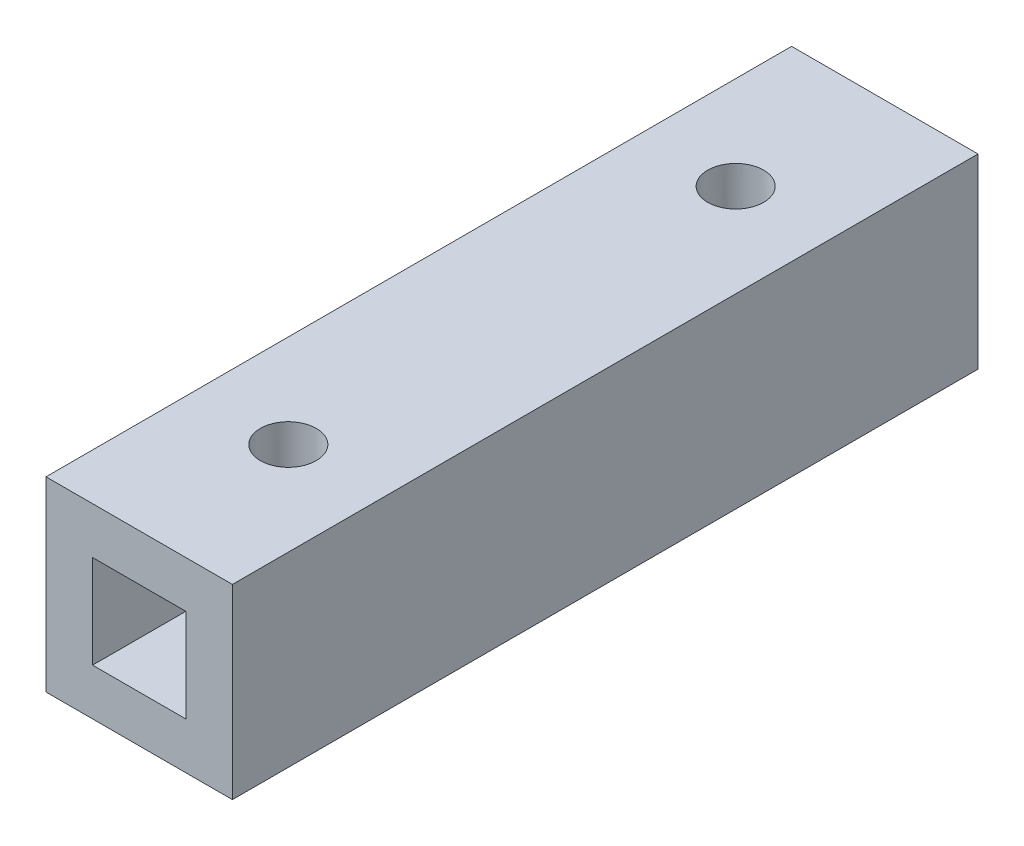
ISO-10303-21;
HEADER;
FILE_DESCRIPTION(('STEP AP214'),'2;1');
FILE_NAME('part.step','',(''),(''),'','','');
FILE_SCHEMA(('AUTOMOTIVE_DESIGN { 1 0 10303 214 1 1 1 1 }'));
ENDSEC;
DATA;
#1=APPLICATION_CONTEXT('core data for automotive mechanical design processes');
#2=APPLICATION_PROTOCOL_DEFINITION('international standard','automotive_design',2000,#1);
#3=PRODUCT_CONTEXT('',#1,'mechanical');
#4=PRODUCT('Part','Part','',(#3));
#5=PRODUCT_RELATED_PRODUCT_CATEGORY('part','',(#4));
#6=PRODUCT_DEFINITION_FORMATION('','',#4);
#7=PRODUCT_DEFINITION_CONTEXT('part definition',#1,'design');
#8=PRODUCT_DEFINITION('design','',#6,#7);
#9=PRODUCT_DEFINITION_SHAPE('','',#8);
#10=(LENGTH_UNIT() NAMED_UNIT(*) SI_UNIT(.MILLI.,.METRE.));
#11=(NAMED_UNIT(*) PLANE_ANGLE_UNIT() SI_UNIT($,.RADIAN.));
#12=(NAMED_UNIT(*) SI_UNIT($,.STERADIAN.) SOLID_ANGLE_UNIT());
#13=UNCERTAINTY_MEASURE_WITH_UNIT(LENGTH_MEASURE(1.E-05),#10,'distance_accuracy_value','');
#14=(GEOMETRIC_REPRESENTATION_CONTEXT(3) GLOBAL_UNCERTAINTY_ASSIGNED_CONTEXT((#13)) GLOBAL_UNIT_ASSIGNED_CONTEXT((#10,
#11,#12)) REPRESENTATION_CONTEXT('',''));
#15=CARTESIAN_POINT('',(0.,0.,0.));
#16=DIRECTION('',(0.,0.,1.));
#17=DIRECTION('',(1.,0.,0.));
#18=AXIS2_PLACEMENT_3D('',#15,#16,#17);
#19=CARTESIAN_POINT('',(0.,-5.,8.));
#20=DIRECTION('',(0.,1.,0.));
#21=DIRECTION('',(0.,0.,1.));
#22=AXIS2_PLACEMENT_3D('',#19,#20,#21);
#23=CYLINDRICAL_SURFACE('',#22,1.5);
#24=CARTESIAN_POINT('',(0.,-2.5,8.));
#25=DIRECTION('',(0.,-1.,0.));
#26=DIRECTION('',(0.,0.,-1.));
#27=AXIS2_PLACEMENT_3D('',#24,#25,#26);
#28=CIRCLE('',#27,1.5);
#29=CARTESIAN_POINT('',(0.,-2.5,6.5));
#30=VERTEX_POINT('',#29);
#31=EDGE_CURVE('E143',#30,#30,#28,.F.);
#32=ORIENTED_EDGE('',*,*,#31,.T.);
#33=EDGE_LOOP('',(#32));
#34=FACE_BOUND('',#33,.T.);
#35=CARTESIAN_POINT('',(0.,-5.,8.));
#36=DIRECTION('',(0.,1.,0.));
#37=DIRECTION('',(0.,0.,1.));
#38=AXIS2_PLACEMENT_3D('',#35,#36,#37);
#39=CIRCLE('',#38,1.5);
#40=CARTESIAN_POINT('',(0.,-5.,9.5));
#41=VERTEX_POINT('',#40);
#42=EDGE_CURVE('E152',#41,#41,#39,.T.);
#43=ORIENTED_EDGE('',*,*,#42,.F.);
#44=EDGE_LOOP('',(#43));
#45=FACE_BOUND('',#44,.T.);
#46=ADVANCED_FACE('F35',(#34,#45),#23,.F.);
#47=CARTESIAN_POINT('',(0.,-5.,32.));
#48=DIRECTION('',(0.,1.,0.));
#49=DIRECTION('',(0.,0.,1.));
#50=AXIS2_PLACEMENT_3D('',#47,#48,#49);
#51=CYLINDRICAL_SURFACE('',#50,1.5);
#52=CARTESIAN_POINT('',(0.,-2.5,32.));
#53=DIRECTION('',(0.,-1.,0.));
#54=DIRECTION('',(0.,0.,-1.));
#55=AXIS2_PLACEMENT_3D('',#52,#53,#54);
#56=CIRCLE('',#55,1.5);
#57=CARTESIAN_POINT('',(0.,-2.5,30.5));
#58=VERTEX_POINT('',#57);
#59=EDGE_CURVE('E39',#58,#58,#56,.F.);
#60=ORIENTED_EDGE('',*,*,#59,.T.);
#61=EDGE_LOOP('',(#60));
#62=FACE_BOUND('',#61,.T.);
#63=CARTESIAN_POINT('',(0.,-5.,32.));
#64=DIRECTION('',(0.,1.,0.));
#65=DIRECTION('',(0.,0.,1.));
#66=AXIS2_PLACEMENT_3D('',#63,#64,#65);
#67=CIRCLE('',#66,1.5);
#68=CARTESIAN_POINT('',(0.,-5.,33.5));
#69=VERTEX_POINT('',#68);
#70=EDGE_CURVE('E146',#69,#69,#67,.T.);
#71=ORIENTED_EDGE('',*,*,#70,.F.);
#72=EDGE_LOOP('',(#71));
#73=FACE_BOUND('',#72,.T.);
#74=ADVANCED_FACE('F202',(#62,#73),#51,.F.);
#75=CARTESIAN_POINT('',(5.,-5.,40.));
#76=DIRECTION('',(-1.,0.,0.));
#77=DIRECTION('',(0.,0.,1.));
#78=AXIS2_PLACEMENT_3D('',#75,#76,#77);
#79=PLANE('',#78);
#80=DIRECTION('',(0.,1.,0.));
#81=VECTOR('',#80,1.);
#82=CARTESIAN_POINT('',(5.,-5.,0.));
#83=LINE('',#82,#81);
#84=CARTESIAN_POINT('',(5.,-5.,0.));
#85=VERTEX_POINT('',#84);
#86=CARTESIAN_POINT('',(5.,5.,0.));
#87=VERTEX_POINT('',#86);
#88=EDGE_CURVE('E158',#85,#87,#83,.T.);
#89=ORIENTED_EDGE('',*,*,#88,.T.);
#90=DIRECTION('',(0.,0.,-1.));
#91=VECTOR('',#90,1.);
#92=CARTESIAN_POINT('',(5.,5.,40.));
#93=LINE('',#92,#91);
#94=CARTESIAN_POINT('',(5.,5.,40.));
#95=VERTEX_POINT('',#94);
#96=EDGE_CURVE('E11',#95,#87,#93,.T.);
#97=ORIENTED_EDGE('',*,*,#96,.F.);
#98=DIRECTION('',(0.,1.,0.));
#99=VECTOR('',#98,1.);
#100=CARTESIAN_POINT('',(5.,-5.,40.));
#101=LINE('',#100,#99);
#102=CARTESIAN_POINT('',(5.,-5.,40.));
#103=VERTEX_POINT('',#102);
#104=EDGE_CURVE('E159',#103,#95,#101,.T.);
#105=ORIENTED_EDGE('',*,*,#104,.F.);
#106=DIRECTION('',(0.,0.,-1.));
#107=VECTOR('',#106,1.);
#108=CARTESIAN_POINT('',(5.,-5.,40.));
#109=LINE('',#108,#107);
#110=EDGE_CURVE('E169',#103,#85,#109,.T.);
#111=ORIENTED_EDGE('',*,*,#110,.T.);
#112=EDGE_LOOP('',(#89,#97,#105,#111));
#113=FACE_BOUND('',#112,.T.);
#114=ADVANCED_FACE('F37',(#113),#79,.F.);
#115=CARTESIAN_POINT('',(-5.,5.,40.));
#116=DIRECTION('',(0.,-1.,0.));
#117=DIRECTION('',(0.,0.,-1.));
#118=AXIS2_PLACEMENT_3D('',#115,#116,#117);
#119=PLANE('',#118);
#120=CARTESIAN_POINT('',(0.,5.,32.));
#121=DIRECTION('',(0.,-1.,0.));
#122=DIRECTION('',(0.,0.,-1.));
#123=AXIS2_PLACEMENT_3D('',#120,#121,#122);
#124=CIRCLE('',#123,1.5);
#125=CARTESIAN_POINT('',(0.,5.,30.5));
#126=VERTEX_POINT('',#125);
#127=EDGE_CURVE('E149',#126,#126,#124,.T.);
#128=ORIENTED_EDGE('',*,*,#127,.T.);
#129=EDGE_LOOP('',(#128));
#130=FACE_BOUND('',#129,.T.);
#131=CARTESIAN_POINT('',(0.,5.,8.));
#132=DIRECTION('',(0.,-1.,0.));
#133=DIRECTION('',(0.,0.,-1.));
#134=AXIS2_PLACEMENT_3D('',#131,#132,#133);
#135=CIRCLE('',#134,1.5);
#136=CARTESIAN_POINT('',(0.,5.,6.5));
#137=VERTEX_POINT('',#136);
#138=EDGE_CURVE('E155',#137,#137,#135,.T.);
#139=ORIENTED_EDGE('',*,*,#138,.T.);
#140=EDGE_LOOP('',(#139));
#141=FACE_BOUND('',#140,.T.);
#142=DIRECTION('',(-1.,0.,0.));
#143=VECTOR('',#142,1.);
#144=CARTESIAN_POINT('',(-5.,5.,0.));
#145=LINE('',#144,#143);
#146=CARTESIAN_POINT('',(-5.,5.,0.));
#147=VERTEX_POINT('',#146);
#148=EDGE_CURVE('E172',#87,#147,#145,.T.);
#149=ORIENTED_EDGE('',*,*,#148,.T.);
#150=DIRECTION('',(0.,0.,-1.));
#151=VECTOR('',#150,1.);
#152=CARTESIAN_POINT('',(-5.,5.,40.));
#153=LINE('',#152,#151);
#154=CARTESIAN_POINT('',(-5.,5.,40.));
#155=VERTEX_POINT('',#154);
#156=EDGE_CURVE('E44',#155,#147,#153,.T.);
#157=ORIENTED_EDGE('',*,*,#156,.F.);
#158=DIRECTION('',(-1.,0.,0.));
#159=VECTOR('',#158,1.);
#160=CARTESIAN_POINT('',(-5.,5.,40.));
#161=LINE('',#160,#159);
#162=EDGE_CURVE('E162',#95,#155,#161,.T.);
#163=ORIENTED_EDGE('',*,*,#162,.F.);
#164=ORIENTED_EDGE('',*,*,#96,.T.);
#165=EDGE_LOOP('',(#149,#157,#163,#164));
#166=FACE_BOUND('',#165,.T.);
#167=ADVANCED_FACE('F225',(#130,#141,#166),#119,.F.);
#168=CARTESIAN_POINT('',(-5.,-5.,40.));
#169=DIRECTION('',(1.,0.,0.));
#170=DIRECTION('',(0.,0.,-1.));
#171=AXIS2_PLACEMENT_3D('',#168,#169,#170);
#172=PLANE('',#171);
#173=DIRECTION('',(0.,-1.,0.));
#174=VECTOR('',#173,1.);
#175=CARTESIAN_POINT('',(-5.,-5.,0.));
#176=LINE('',#175,#174);
#177=CARTESIAN_POINT('',(-5.,-5.,0.));
#178=VERTEX_POINT('',#177);
#179=EDGE_CURVE('E174',#147,#178,#176,.T.);
#180=ORIENTED_EDGE('',*,*,#179,.T.);
#181=DIRECTION('',(0.,0.,-1.));
#182=VECTOR('',#181,1.);
#183=CARTESIAN_POINT('',(-5.,-5.,40.));
#184=LINE('',#183,#182);
#185=CARTESIAN_POINT('',(-5.,-5.,40.));
#186=VERTEX_POINT('',#185);
#187=EDGE_CURVE('E179',#186,#178,#184,.T.);
#188=ORIENTED_EDGE('',*,*,#187,.F.);
#189=DIRECTION('',(0.,-1.,0.));
#190=VECTOR('',#189,1.);
#191=CARTESIAN_POINT('',(-5.,-5.,40.));
#192=LINE('',#191,#190);
#193=EDGE_CURVE('E165',#155,#186,#192,.T.);
#194=ORIENTED_EDGE('',*,*,#193,.F.);
#195=ORIENTED_EDGE('',*,*,#156,.T.);
#196=EDGE_LOOP('',(#180,#188,#194,#195));
#197=FACE_BOUND('',#196,.T.);
#198=ADVANCED_FACE('F228',(#197),#172,.F.);
#199=CARTESIAN_POINT('',(-5.,-5.,40.));
#200=DIRECTION('',(0.,1.,0.));
#201=DIRECTION('',(0.,0.,1.));
#202=AXIS2_PLACEMENT_3D('',#199,#200,#201);
#203=PLANE('',#202);
#204=ORIENTED_EDGE('',*,*,#70,.T.);
#205=EDGE_LOOP('',(#204));
#206=FACE_BOUND('',#205,.T.);
#207=ORIENTED_EDGE('',*,*,#42,.T.);
#208=EDGE_LOOP('',(#207));
#209=FACE_BOUND('',#208,.T.);
#210=DIRECTION('',(1.,0.,0.));
#211=VECTOR('',#210,1.);
#212=CARTESIAN_POINT('',(-5.,-5.,0.));
#213=LINE('',#212,#211);
#214=EDGE_CURVE('E163',#178,#85,#213,.T.);
#215=ORIENTED_EDGE('',*,*,#214,.T.);
#216=ORIENTED_EDGE('',*,*,#110,.F.);
#217=DIRECTION('',(1.,0.,0.));
#218=VECTOR('',#217,1.);
#219=CARTESIAN_POINT('',(-5.,-5.,40.));
#220=LINE('',#219,#218);
#221=EDGE_CURVE('E167',#186,#103,#220,.T.);
#222=ORIENTED_EDGE('',*,*,#221,.F.);
#223=ORIENTED_EDGE('',*,*,#187,.T.);
#224=EDGE_LOOP('',(#215,#216,#222,#223));
#225=FACE_BOUND('',#224,.T.);
#226=ADVANCED_FACE('F240',(#206,#209,#225),#203,.F.);
#227=CARTESIAN_POINT('',(0.,0.,40.));
#228=DIRECTION('',(0.,0.,-1.));
#229=DIRECTION('',(-1.,0.,0.));
#230=AXIS2_PLACEMENT_3D('',#227,#228,#229);
#231=PLANE('',#230);
#232=DIRECTION('',(-1.,0.,0.));
#233=VECTOR('',#232,1.);
#234=CARTESIAN_POINT('',(-2.5,2.5,40.));
#235=LINE('',#234,#233);
#236=CARTESIAN_POINT('',(2.5,2.5,40.));
#237=VERTEX_POINT('',#236);
#238=CARTESIAN_POINT('',(-2.5,2.5,40.));
#239=VERTEX_POINT('',#238);
#240=EDGE_CURVE('E130',#237,#239,#235,.T.);
#241=ORIENTED_EDGE('',*,*,#240,.F.);
#242=DIRECTION('',(0.,1.,0.));
#243=VECTOR('',#242,1.);
#244=CARTESIAN_POINT('',(2.5,2.5,40.));
#245=LINE('',#244,#243);
#246=CARTESIAN_POINT('',(2.5,-2.5,40.));
#247=VERTEX_POINT('',#246);
#248=EDGE_CURVE('E52',#247,#237,#245,.T.);
#249=ORIENTED_EDGE('',*,*,#248,.F.);
#250=DIRECTION('',(1.,0.,0.));
#251=VECTOR('',#250,1.);
#252=CARTESIAN_POINT('',(-2.5,-2.5,40.));
#253=LINE('',#252,#251);
#254=CARTESIAN_POINT('',(-2.5,-2.5,40.));
#255=VERTEX_POINT('',#254);
#256=EDGE_CURVE('E121',#255,#247,#253,.T.);
#257=ORIENTED_EDGE('',*,*,#256,.F.);
#258=DIRECTION('',(0.,-1.,0.));
#259=VECTOR('',#258,1.);
#260=CARTESIAN_POINT('',(-2.5,2.5,40.));
#261=LINE('',#260,#259);
#262=EDGE_CURVE('E124',#239,#255,#261,.T.);
#263=ORIENTED_EDGE('',*,*,#262,.F.);
#264=EDGE_LOOP('',(#241,#249,#257,#263));
#265=FACE_BOUND('',#264,.T.);
#266=ORIENTED_EDGE('',*,*,#104,.T.);
#267=ORIENTED_EDGE('',*,*,#162,.T.);
#268=ORIENTED_EDGE('',*,*,#193,.T.);
#269=ORIENTED_EDGE('',*,*,#221,.T.);
#270=EDGE_LOOP('',(#266,#267,#268,#269));
#271=FACE_BOUND('',#270,.T.);
#272=ADVANCED_FACE('F219',(#265,#271),#231,.F.);
#273=CARTESIAN_POINT('',(0.,0.,0.));
#274=DIRECTION('',(0.,0.,-1.));
#275=DIRECTION('',(-1.,0.,0.));
#276=AXIS2_PLACEMENT_3D('',#273,#274,#275);
#277=PLANE('',#276);
#278=DIRECTION('',(0.,1.,0.));
#279=VECTOR('',#278,1.);
#280=CARTESIAN_POINT('',(2.5,2.5,0.));
#281=LINE('',#280,#279);
#282=CARTESIAN_POINT('',(2.5,-2.5,0.));
#283=VERTEX_POINT('',#282);
#284=CARTESIAN_POINT('',(2.5,2.5,0.));
#285=VERTEX_POINT('',#284);
#286=EDGE_CURVE('E104',#283,#285,#281,.T.);
#287=ORIENTED_EDGE('',*,*,#286,.T.);
#288=DIRECTION('',(-1.,0.,0.));
#289=VECTOR('',#288,1.);
#290=CARTESIAN_POINT('',(-2.5,2.5,0.));
#291=LINE('',#290,#289);
#292=CARTESIAN_POINT('',(-2.5,2.5,0.));
#293=VERTEX_POINT('',#292);
#294=EDGE_CURVE('E113',#285,#293,#291,.T.);
#295=ORIENTED_EDGE('',*,*,#294,.T.);
#296=DIRECTION('',(0.,-1.,0.));
#297=VECTOR('',#296,1.);
#298=CARTESIAN_POINT('',(-2.5,2.5,0.));
#299=LINE('',#298,#297);
#300=CARTESIAN_POINT('',(-2.5,-2.5,0.));
#301=VERTEX_POINT('',#300);
#302=EDGE_CURVE('E60',#293,#301,#299,.T.);
#303=ORIENTED_EDGE('',*,*,#302,.T.);
#304=DIRECTION('',(1.,0.,0.));
#305=VECTOR('',#304,1.);
#306=CARTESIAN_POINT('',(-2.5,-2.5,0.));
#307=LINE('',#306,#305);
#308=EDGE_CURVE('E110',#301,#283,#307,.T.);
#309=ORIENTED_EDGE('',*,*,#308,.T.);
#310=EDGE_LOOP('',(#287,#295,#303,#309));
#311=FACE_BOUND('',#310,.T.);
#312=ORIENTED_EDGE('',*,*,#88,.F.);
#313=ORIENTED_EDGE('',*,*,#214,.F.);
#314=ORIENTED_EDGE('',*,*,#179,.F.);
#315=ORIENTED_EDGE('',*,*,#148,.F.);
#316=EDGE_LOOP('',(#312,#313,#314,#315));
#317=FACE_BOUND('',#316,.T.);
#318=ADVANCED_FACE('F118',(#311,#317),#277,.T.);
#319=CARTESIAN_POINT('',(0.,2.5,8.));
#320=DIRECTION('',(0.,1.,0.));
#321=DIRECTION('',(0.,0.,1.));
#322=AXIS2_PLACEMENT_3D('',#319,#320,#321);
#323=CIRCLE('',#322,1.5);
#324=CARTESIAN_POINT('',(0.,2.5,9.5));
#325=VERTEX_POINT('',#324);
#326=EDGE_CURVE('E140',#325,#325,#323,.F.);
#327=ORIENTED_EDGE('',*,*,#326,.T.);
#328=EDGE_LOOP('',(#327));
#329=FACE_BOUND('',#328,.T.);
#330=ORIENTED_EDGE('',*,*,#138,.F.);
#331=EDGE_LOOP('',(#330));
#332=FACE_BOUND('',#331,.T.);
#333=ADVANCED_FACE('F205',(#329,#332),#23,.F.);
#334=CARTESIAN_POINT('',(0.,2.5,32.));
#335=DIRECTION('',(0.,1.,0.));
#336=DIRECTION('',(0.,0.,1.));
#337=AXIS2_PLACEMENT_3D('',#334,#335,#336);
#338=CIRCLE('',#337,1.5);
#339=CARTESIAN_POINT('',(0.,2.5,33.5));
#340=VERTEX_POINT('',#339);
#341=EDGE_CURVE('E136',#340,#340,#338,.F.);
#342=ORIENTED_EDGE('',*,*,#341,.T.);
#343=EDGE_LOOP('',(#342));
#344=FACE_BOUND('',#343,.T.);
#345=ORIENTED_EDGE('',*,*,#127,.F.);
#346=EDGE_LOOP('',(#345));
#347=FACE_BOUND('',#346,.T.);
#348=ADVANCED_FACE('F186',(#344,#347),#51,.F.);
#349=CARTESIAN_POINT('',(-2.5,-2.5,0.));
#350=DIRECTION('',(0.,-1.,0.));
#351=DIRECTION('',(0.,0.,-1.));
#352=AXIS2_PLACEMENT_3D('',#349,#350,#351);
#353=PLANE('',#352);
#354=ORIENTED_EDGE('',*,*,#59,.F.);
#355=EDGE_LOOP('',(#354));
#356=FACE_BOUND('',#355,.T.);
#357=ORIENTED_EDGE('',*,*,#256,.T.);
#358=DIRECTION('',(0.,0.,1.));
#359=VECTOR('',#358,1.);
#360=CARTESIAN_POINT('',(2.5,-2.5,0.));
#361=LINE('',#360,#359);
#362=EDGE_CURVE('E134',#283,#247,#361,.T.);
#363=ORIENTED_EDGE('',*,*,#362,.F.);
#364=ORIENTED_EDGE('',*,*,#308,.F.);
#365=DIRECTION('',(0.,0.,1.));
#366=VECTOR('',#365,1.);
#367=CARTESIAN_POINT('',(-2.5,-2.5,0.));
#368=LINE('',#367,#366);
#369=EDGE_CURVE('E137',#301,#255,#368,.T.);
#370=ORIENTED_EDGE('',*,*,#369,.T.);
#371=EDGE_LOOP('',(#357,#363,#364,#370));
#372=FACE_BOUND('',#371,.T.);
#373=ORIENTED_EDGE('',*,*,#31,.F.);
#374=EDGE_LOOP('',(#373));
#375=FACE_BOUND('',#374,.T.);
#376=ADVANCED_FACE('F190',(#356,#372,#375),#353,.F.);
#377=CARTESIAN_POINT('',(-2.5,2.5,0.));
#378=DIRECTION('',(0.,1.,0.));
#379=DIRECTION('',(0.,0.,1.));
#380=AXIS2_PLACEMENT_3D('',#377,#378,#379);
#381=PLANE('',#380);
#382=ORIENTED_EDGE('',*,*,#341,.F.);
#383=EDGE_LOOP('',(#382));
#384=FACE_BOUND('',#383,.T.);
#385=ORIENTED_EDGE('',*,*,#240,.T.);
#386=DIRECTION('',(0.,0.,1.));
#387=VECTOR('',#386,1.);
#388=CARTESIAN_POINT('',(-2.5,2.5,0.));
#389=LINE('',#388,#387);
#390=EDGE_CURVE('E109',#293,#239,#389,.T.);
#391=ORIENTED_EDGE('',*,*,#390,.F.);
#392=ORIENTED_EDGE('',*,*,#294,.F.);
#393=DIRECTION('',(0.,0.,1.));
#394=VECTOR('',#393,1.);
#395=CARTESIAN_POINT('',(2.5,2.5,0.));
#396=LINE('',#395,#394);
#397=EDGE_CURVE('E100',#285,#237,#396,.T.);
#398=ORIENTED_EDGE('',*,*,#397,.T.);
#399=EDGE_LOOP('',(#385,#391,#392,#398));
#400=FACE_BOUND('',#399,.T.);
#401=ORIENTED_EDGE('',*,*,#326,.F.);
#402=EDGE_LOOP('',(#401));
#403=FACE_BOUND('',#402,.T.);
#404=ADVANCED_FACE('F114',(#384,#400,#403),#381,.F.);
#405=CARTESIAN_POINT('',(2.5,2.5,0.));
#406=DIRECTION('',(1.,0.,0.));
#407=DIRECTION('',(0.,0.,-1.));
#408=AXIS2_PLACEMENT_3D('',#405,#406,#407);
#409=PLANE('',#408);
#410=ORIENTED_EDGE('',*,*,#248,.T.);
#411=ORIENTED_EDGE('',*,*,#397,.F.);
#412=ORIENTED_EDGE('',*,*,#286,.F.);
#413=ORIENTED_EDGE('',*,*,#362,.T.);
#414=EDGE_LOOP('',(#410,#411,#412,#413));
#415=FACE_BOUND('',#414,.T.);
#416=ADVANCED_FACE('F102',(#415),#409,.F.);
#417=CARTESIAN_POINT('',(-2.5,2.5,0.));
#418=DIRECTION('',(-1.,0.,0.));
#419=DIRECTION('',(0.,0.,1.));
#420=AXIS2_PLACEMENT_3D('',#417,#418,#419);
#421=PLANE('',#420);
#422=ORIENTED_EDGE('',*,*,#262,.T.);
#423=ORIENTED_EDGE('',*,*,#369,.F.);
#424=ORIENTED_EDGE('',*,*,#302,.F.);
#425=ORIENTED_EDGE('',*,*,#390,.T.);
#426=EDGE_LOOP('',(#422,#423,#424,#425));
#427=FACE_BOUND('',#426,.T.);
#428=ADVANCED_FACE('F196',(#427),#421,.F.);
#429=CLOSED_SHELL('',(#46,#74,#114,#167,#198,#226,#272,#318,#333,#348,#376,#404,#416,#428));
#430=MANIFOLD_SOLID_BREP('B2',#429);
#431=ADVANCED_BREP_SHAPE_REPRESENTATION('',(#18,#430),#14);
#432=SHAPE_DEFINITION_REPRESENTATION(#9,#431);
ENDSEC;
END-ISO-10303-21;
